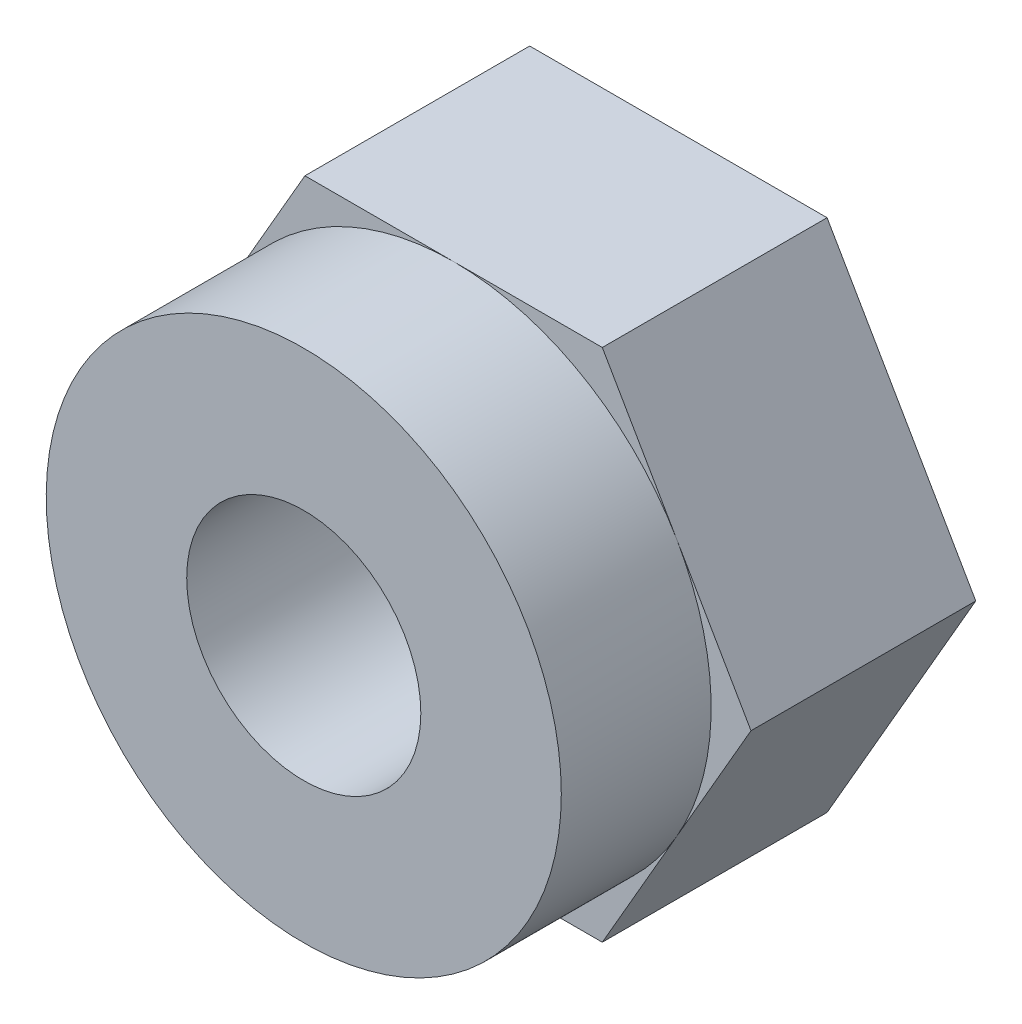
ISO-10303-21;
HEADER;
FILE_DESCRIPTION(('STEP AP214'),'2;1');
FILE_NAME('part.step','',(''),(''),'','','');
FILE_SCHEMA(('AUTOMOTIVE_DESIGN { 1 0 10303 214 1 1 1 1 }'));
ENDSEC;
DATA;
#1=APPLICATION_CONTEXT('core data for automotive mechanical design processes');
#2=APPLICATION_PROTOCOL_DEFINITION('international standard','automotive_design',2000,#1);
#3=PRODUCT_CONTEXT('',#1,'mechanical');
#4=PRODUCT('Part','Part','',(#3));
#5=PRODUCT_RELATED_PRODUCT_CATEGORY('part','',(#4));
#6=PRODUCT_DEFINITION_FORMATION('','',#4);
#7=PRODUCT_DEFINITION_CONTEXT('part definition',#1,'design');
#8=PRODUCT_DEFINITION('design','',#6,#7);
#9=PRODUCT_DEFINITION_SHAPE('','',#8);
#10=(LENGTH_UNIT() NAMED_UNIT(*) SI_UNIT(.MILLI.,.METRE.));
#11=(NAMED_UNIT(*) PLANE_ANGLE_UNIT() SI_UNIT($,.RADIAN.));
#12=(NAMED_UNIT(*) SI_UNIT($,.STERADIAN.) SOLID_ANGLE_UNIT());
#13=UNCERTAINTY_MEASURE_WITH_UNIT(LENGTH_MEASURE(1.E-05),#10,'distance_accuracy_value','');
#14=(GEOMETRIC_REPRESENTATION_CONTEXT(3) GLOBAL_UNCERTAINTY_ASSIGNED_CONTEXT((#13)) GLOBAL_UNIT_ASSIGNED_CONTEXT((#10,
#11,#12)) REPRESENTATION_CONTEXT('',''));
#15=CARTESIAN_POINT('',(0.,0.,0.));
#16=DIRECTION('',(0.,0.,1.));
#17=DIRECTION('',(1.,0.,0.));
#18=AXIS2_PLACEMENT_3D('',#15,#16,#17);
#19=CARTESIAN_POINT('',(0.,0.,2.4));
#20=DIRECTION('',(0.,0.,1.));
#21=DIRECTION('',(1.,0.,0.));
#22=AXIS2_PLACEMENT_3D('',#19,#20,#21);
#23=PLANE('',#22);
#24=DIRECTION('',(0.499999999999999,0.866025403784439,0.));
#25=VECTOR('',#24,1.);
#26=CARTESIAN_POINT('',(1.58771324027147,-2.75,2.4));
#27=LINE('',#26,#25);
#28=CARTESIAN_POINT('',(1.58771324027147,-2.75,2.4));
#29=VERTEX_POINT('',#28);
#30=CARTESIAN_POINT('',(2.3815698604072,-1.375,2.4));
#31=VERTEX_POINT('',#30);
#32=EDGE_CURVE('E200',#29,#31,#27,.T.);
#33=ORIENTED_EDGE('',*,*,#32,.T.);
#34=CARTESIAN_POINT('',(0.,0.,2.4));
#35=DIRECTION('',(0.,0.,1.));
#36=DIRECTION('',(1.,0.,0.));
#37=AXIS2_PLACEMENT_3D('',#34,#35,#36);
#38=CIRCLE('',#37,2.75);
#39=CARTESIAN_POINT('',(0.,-2.75,2.4));
#40=VERTEX_POINT('',#39);
#41=EDGE_CURVE('E49',#31,#40,#38,.F.);
#42=ORIENTED_EDGE('',*,*,#41,.T.);
#43=DIRECTION('',(1.,0.,0.));
#44=VECTOR('',#43,1.);
#45=CARTESIAN_POINT('',(-1.58771324027147,-2.75,2.4));
#46=LINE('',#45,#44);
#47=EDGE_CURVE('E57',#40,#29,#46,.T.);
#48=ORIENTED_EDGE('',*,*,#47,.T.);
#49=EDGE_LOOP('',(#33,#42,#48));
#50=FACE_BOUND('',#49,.T.);
#51=ADVANCED_FACE('F34',(#50),#23,.T.);
#52=CARTESIAN_POINT('',(-1.58771324027147,-2.75,2.4));
#53=VERTEX_POINT('',#52);
#54=EDGE_CURVE('E138',#53,#40,#46,.T.);
#55=ORIENTED_EDGE('',*,*,#54,.T.);
#56=CARTESIAN_POINT('',(-2.3815698604072,-1.375,2.4));
#57=VERTEX_POINT('',#56);
#58=EDGE_CURVE('E179',#40,#57,#38,.F.);
#59=ORIENTED_EDGE('',*,*,#58,.T.);
#60=DIRECTION('',(0.5,-0.866025403784438,0.));
#61=VECTOR('',#60,1.);
#62=CARTESIAN_POINT('',(-3.17542648054294,0.,2.4));
#63=LINE('',#62,#61);
#64=EDGE_CURVE('E136',#57,#53,#63,.T.);
#65=ORIENTED_EDGE('',*,*,#64,.T.);
#66=EDGE_LOOP('',(#55,#59,#65));
#67=FACE_BOUND('',#66,.T.);
#68=ADVANCED_FACE('F178',(#67),#23,.T.);
#69=CARTESIAN_POINT('',(-3.17542648054294,0.,2.4));
#70=VERTEX_POINT('',#69);
#71=EDGE_CURVE('E112',#70,#57,#63,.T.);
#72=ORIENTED_EDGE('',*,*,#71,.T.);
#73=CARTESIAN_POINT('',(-2.38156986040721,1.375,2.4));
#74=VERTEX_POINT('',#73);
#75=EDGE_CURVE('E115',#57,#74,#38,.F.);
#76=ORIENTED_EDGE('',*,*,#75,.T.);
#77=DIRECTION('',(-0.499999999999999,-0.866025403784439,0.));
#78=VECTOR('',#77,1.);
#79=CARTESIAN_POINT('',(-1.58771324027147,2.75,2.4));
#80=LINE('',#79,#78);
#81=EDGE_CURVE('E107',#74,#70,#80,.T.);
#82=ORIENTED_EDGE('',*,*,#81,.T.);
#83=EDGE_LOOP('',(#72,#76,#82));
#84=FACE_BOUND('',#83,.T.);
#85=ADVANCED_FACE('F109',(#84),#23,.T.);
#86=CARTESIAN_POINT('',(-1.58771324027147,2.75,2.4));
#87=VERTEX_POINT('',#86);
#88=EDGE_CURVE('E119',#87,#74,#80,.T.);
#89=ORIENTED_EDGE('',*,*,#88,.T.);
#90=CARTESIAN_POINT('',(0.,2.75,2.4));
#91=VERTEX_POINT('',#90);
#92=EDGE_CURVE('E192',#74,#91,#38,.F.);
#93=ORIENTED_EDGE('',*,*,#92,.T.);
#94=DIRECTION('',(-1.,0.,0.));
#95=VECTOR('',#94,1.);
#96=CARTESIAN_POINT('',(1.58771324027147,2.75,2.4));
#97=LINE('',#96,#95);
#98=EDGE_CURVE('E203',#91,#87,#97,.T.);
#99=ORIENTED_EDGE('',*,*,#98,.T.);
#100=EDGE_LOOP('',(#89,#93,#99));
#101=FACE_BOUND('',#100,.T.);
#102=ADVANCED_FACE('F237',(#101),#23,.T.);
#103=CARTESIAN_POINT('',(1.58771324027147,2.75,2.4));
#104=VERTEX_POINT('',#103);
#105=EDGE_CURVE('E120',#104,#91,#97,.T.);
#106=ORIENTED_EDGE('',*,*,#105,.T.);
#107=CARTESIAN_POINT('',(2.38156986040721,1.375,2.4));
#108=VERTEX_POINT('',#107);
#109=EDGE_CURVE('E187',#91,#108,#38,.F.);
#110=ORIENTED_EDGE('',*,*,#109,.T.);
#111=DIRECTION('',(-0.5,0.866025403784438,0.));
#112=VECTOR('',#111,1.);
#113=CARTESIAN_POINT('',(3.17542648054294,0.,2.4));
#114=LINE('',#113,#112);
#115=EDGE_CURVE('E196',#108,#104,#114,.T.);
#116=ORIENTED_EDGE('',*,*,#115,.T.);
#117=EDGE_LOOP('',(#106,#110,#116));
#118=FACE_BOUND('',#117,.T.);
#119=ADVANCED_FACE('F195',(#118),#23,.T.);
#120=CARTESIAN_POINT('',(3.17542648054294,0.,2.4));
#121=VERTEX_POINT('',#120);
#122=EDGE_CURVE('E198',#121,#108,#114,.T.);
#123=ORIENTED_EDGE('',*,*,#122,.T.);
#124=EDGE_CURVE('E189',#108,#31,#38,.F.);
#125=ORIENTED_EDGE('',*,*,#124,.T.);
#126=EDGE_CURVE('E93',#31,#121,#27,.T.);
#127=ORIENTED_EDGE('',*,*,#126,.T.);
#128=EDGE_LOOP('',(#123,#125,#127));
#129=FACE_BOUND('',#128,.T.);
#130=ADVANCED_FACE('F202',(#129),#23,.T.);
#131=CARTESIAN_POINT('',(0.,0.,0.));
#132=DIRECTION('',(0.,0.,1.));
#133=DIRECTION('',(1.,0.,0.));
#134=AXIS2_PLACEMENT_3D('',#131,#132,#133);
#135=PLANE('',#134);
#136=DIRECTION('',(-0.5,0.866025403784438,0.));
#137=VECTOR('',#136,1.);
#138=CARTESIAN_POINT('',(3.17542648054294,0.,0.));
#139=LINE('',#138,#137);
#140=CARTESIAN_POINT('',(3.17542648054294,0.,0.));
#141=VERTEX_POINT('',#140);
#142=CARTESIAN_POINT('',(1.58771324027147,2.75,0.));
#143=VERTEX_POINT('',#142);
#144=EDGE_CURVE('E146',#141,#143,#139,.T.);
#145=ORIENTED_EDGE('',*,*,#144,.F.);
#146=DIRECTION('',(0.499999999999999,0.866025403784439,0.));
#147=VECTOR('',#146,1.);
#148=CARTESIAN_POINT('',(1.58771324027147,-2.75,0.));
#149=LINE('',#148,#147);
#150=CARTESIAN_POINT('',(1.58771324027147,-2.75,0.));
#151=VERTEX_POINT('',#150);
#152=EDGE_CURVE('E144',#151,#141,#149,.T.);
#153=ORIENTED_EDGE('',*,*,#152,.F.);
#154=DIRECTION('',(1.,0.,0.));
#155=VECTOR('',#154,1.);
#156=CARTESIAN_POINT('',(-1.58771324027147,-2.75,0.));
#157=LINE('',#156,#155);
#158=CARTESIAN_POINT('',(-1.58771324027147,-2.75,0.));
#159=VERTEX_POINT('',#158);
#160=EDGE_CURVE('E85',#159,#151,#157,.T.);
#161=ORIENTED_EDGE('',*,*,#160,.F.);
#162=DIRECTION('',(0.5,-0.866025403784438,0.));
#163=VECTOR('',#162,1.);
#164=CARTESIAN_POINT('',(-3.17542648054294,0.,0.));
#165=LINE('',#164,#163);
#166=CARTESIAN_POINT('',(-3.17542648054294,0.,0.));
#167=VERTEX_POINT('',#166);
#168=EDGE_CURVE('E152',#167,#159,#165,.T.);
#169=ORIENTED_EDGE('',*,*,#168,.F.);
#170=DIRECTION('',(-0.499999999999999,-0.866025403784439,0.));
#171=VECTOR('',#170,1.);
#172=CARTESIAN_POINT('',(-1.58771324027147,2.75,0.));
#173=LINE('',#172,#171);
#174=CARTESIAN_POINT('',(-1.58771324027147,2.75,0.));
#175=VERTEX_POINT('',#174);
#176=EDGE_CURVE('E127',#175,#167,#173,.T.);
#177=ORIENTED_EDGE('',*,*,#176,.F.);
#178=DIRECTION('',(-1.,0.,0.));
#179=VECTOR('',#178,1.);
#180=CARTESIAN_POINT('',(1.58771324027147,2.75,0.));
#181=LINE('',#180,#179);
#182=EDGE_CURVE('E149',#143,#175,#181,.T.);
#183=ORIENTED_EDGE('',*,*,#182,.F.);
#184=EDGE_LOOP('',(#145,#153,#161,#169,#177,#183));
#185=FACE_BOUND('',#184,.T.);
#186=CARTESIAN_POINT('',(0.,0.,0.));
#187=DIRECTION('',(0.,0.,1.));
#188=DIRECTION('',(1.,0.,0.));
#189=AXIS2_PLACEMENT_3D('',#186,#187,#188);
#190=CIRCLE('',#189,1.25);
#191=CARTESIAN_POINT('',(1.25,0.,0.));
#192=VERTEX_POINT('',#191);
#193=EDGE_CURVE('E147',#192,#192,#190,.T.);
#194=ORIENTED_EDGE('',*,*,#193,.T.);
#195=EDGE_LOOP('',(#194));
#196=FACE_BOUND('',#195,.T.);
#197=ADVANCED_FACE('F170',(#185,#196),#135,.F.);
#198=CARTESIAN_POINT('',(1.58771324027147,-2.75,2.4));
#199=DIRECTION('',(-0.866025403784439,0.499999999999999,0.));
#200=DIRECTION('',(-0.499999999999999,-0.866025403784439,0.));
#201=AXIS2_PLACEMENT_3D('',#198,#199,#200);
#202=PLANE('',#201);
#203=ORIENTED_EDGE('',*,*,#152,.T.);
#204=DIRECTION('',(0.,0.,-1.));
#205=VECTOR('',#204,1.);
#206=CARTESIAN_POINT('',(3.17542648054294,0.,2.4));
#207=LINE('',#206,#205);
#208=EDGE_CURVE('E11',#121,#141,#207,.T.);
#209=ORIENTED_EDGE('',*,*,#208,.F.);
#210=ORIENTED_EDGE('',*,*,#126,.F.);
#211=ORIENTED_EDGE('',*,*,#32,.F.);
#212=DIRECTION('',(0.,0.,-1.));
#213=VECTOR('',#212,1.);
#214=CARTESIAN_POINT('',(1.58771324027147,-2.75,2.4));
#215=LINE('',#214,#213);
#216=EDGE_CURVE('E143',#29,#151,#215,.T.);
#217=ORIENTED_EDGE('',*,*,#216,.T.);
#218=EDGE_LOOP('',(#203,#209,#210,#211,#217));
#219=FACE_BOUND('',#218,.T.);
#220=ADVANCED_FACE('F36',(#219),#202,.F.);
#221=CARTESIAN_POINT('',(3.17542648054294,0.,2.4));
#222=DIRECTION('',(-0.866025403784438,-0.5,0.));
#223=DIRECTION('',(0.5,-0.866025403784439,0.));
#224=AXIS2_PLACEMENT_3D('',#221,#222,#223);
#225=PLANE('',#224);
#226=ORIENTED_EDGE('',*,*,#144,.T.);
#227=DIRECTION('',(0.,0.,-1.));
#228=VECTOR('',#227,1.);
#229=CARTESIAN_POINT('',(1.58771324027147,2.75,2.4));
#230=LINE('',#229,#228);
#231=EDGE_CURVE('E42',#104,#143,#230,.T.);
#232=ORIENTED_EDGE('',*,*,#231,.F.);
#233=ORIENTED_EDGE('',*,*,#115,.F.);
#234=ORIENTED_EDGE('',*,*,#122,.F.);
#235=ORIENTED_EDGE('',*,*,#208,.T.);
#236=EDGE_LOOP('',(#226,#232,#233,#234,#235));
#237=FACE_BOUND('',#236,.T.);
#238=ADVANCED_FACE('F197',(#237),#225,.F.);
#239=CARTESIAN_POINT('',(1.58771324027147,2.75,2.4));
#240=DIRECTION('',(0.,-1.,0.));
#241=DIRECTION('',(0.,0.,-1.));
#242=AXIS2_PLACEMENT_3D('',#239,#240,#241);
#243=PLANE('',#242);
#244=ORIENTED_EDGE('',*,*,#182,.T.);
#245=DIRECTION('',(0.,0.,-1.));
#246=VECTOR('',#245,1.);
#247=CARTESIAN_POINT('',(-1.58771324027147,2.75,2.4));
#248=LINE('',#247,#246);
#249=EDGE_CURVE('E130',#87,#175,#248,.T.);
#250=ORIENTED_EDGE('',*,*,#249,.F.);
#251=ORIENTED_EDGE('',*,*,#98,.F.);
#252=ORIENTED_EDGE('',*,*,#105,.F.);
#253=ORIENTED_EDGE('',*,*,#231,.T.);
#254=EDGE_LOOP('',(#244,#250,#251,#252,#253));
#255=FACE_BOUND('',#254,.T.);
#256=ADVANCED_FACE('F162',(#255),#243,.F.);
#257=CARTESIAN_POINT('',(-1.58771324027147,2.75,2.4));
#258=DIRECTION('',(0.866025403784439,-0.499999999999999,0.));
#259=DIRECTION('',(0.499999999999999,0.866025403784439,0.));
#260=AXIS2_PLACEMENT_3D('',#257,#258,#259);
#261=PLANE('',#260);
#262=ORIENTED_EDGE('',*,*,#176,.T.);
#263=DIRECTION('',(0.,0.,-1.));
#264=VECTOR('',#263,1.);
#265=CARTESIAN_POINT('',(-3.17542648054294,0.,2.4));
#266=LINE('',#265,#264);
#267=EDGE_CURVE('E123',#70,#167,#266,.T.);
#268=ORIENTED_EDGE('',*,*,#267,.F.);
#269=ORIENTED_EDGE('',*,*,#81,.F.);
#270=ORIENTED_EDGE('',*,*,#88,.F.);
#271=ORIENTED_EDGE('',*,*,#249,.T.);
#272=EDGE_LOOP('',(#262,#268,#269,#270,#271));
#273=FACE_BOUND('',#272,.T.);
#274=ADVANCED_FACE('F124',(#273),#261,.F.);
#275=CARTESIAN_POINT('',(-3.17542648054294,0.,2.4));
#276=DIRECTION('',(0.866025403784439,0.5,0.));
#277=DIRECTION('',(-0.5,0.866025403784439,0.));
#278=AXIS2_PLACEMENT_3D('',#275,#276,#277);
#279=PLANE('',#278);
#280=ORIENTED_EDGE('',*,*,#168,.T.);
#281=DIRECTION('',(0.,0.,-1.));
#282=VECTOR('',#281,1.);
#283=CARTESIAN_POINT('',(-1.58771324027147,-2.75,2.4));
#284=LINE('',#283,#282);
#285=EDGE_CURVE('E131',#53,#159,#284,.T.);
#286=ORIENTED_EDGE('',*,*,#285,.F.);
#287=ORIENTED_EDGE('',*,*,#64,.F.);
#288=ORIENTED_EDGE('',*,*,#71,.F.);
#289=ORIENTED_EDGE('',*,*,#267,.T.);
#290=EDGE_LOOP('',(#280,#286,#287,#288,#289));
#291=FACE_BOUND('',#290,.T.);
#292=ADVANCED_FACE('F134',(#291),#279,.F.);
#293=CARTESIAN_POINT('',(-1.58771324027147,-2.75,2.4));
#294=DIRECTION('',(0.,1.,0.));
#295=DIRECTION('',(-1.,0.,0.));
#296=AXIS2_PLACEMENT_3D('',#293,#294,#295);
#297=PLANE('',#296);
#298=ORIENTED_EDGE('',*,*,#160,.T.);
#299=ORIENTED_EDGE('',*,*,#216,.F.);
#300=ORIENTED_EDGE('',*,*,#47,.F.);
#301=ORIENTED_EDGE('',*,*,#54,.F.);
#302=ORIENTED_EDGE('',*,*,#285,.T.);
#303=EDGE_LOOP('',(#298,#299,#300,#301,#302));
#304=FACE_BOUND('',#303,.T.);
#305=ADVANCED_FACE('F174',(#304),#297,.F.);
#306=CARTESIAN_POINT('',(0.,0.,2.4));
#307=DIRECTION('',(0.,0.,-1.));
#308=DIRECTION('',(-1.,0.,0.));
#309=AXIS2_PLACEMENT_3D('',#306,#307,#308);
#310=CYLINDRICAL_SURFACE('',#309,1.25);
#311=ORIENTED_EDGE('',*,*,#193,.F.);
#312=EDGE_LOOP('',(#311));
#313=FACE_BOUND('',#312,.T.);
#314=CARTESIAN_POINT('',(0.,0.,4.));
#315=DIRECTION('',(0.,0.,1.));
#316=DIRECTION('',(1.,0.,0.));
#317=AXIS2_PLACEMENT_3D('',#314,#315,#316);
#318=CIRCLE('',#317,1.25);
#319=CARTESIAN_POINT('',(1.25,0.,4.));
#320=VERTEX_POINT('',#319);
#321=EDGE_CURVE('E211',#320,#320,#318,.T.);
#322=ORIENTED_EDGE('',*,*,#321,.T.);
#323=EDGE_LOOP('',(#322));
#324=FACE_BOUND('',#323,.T.);
#325=ADVANCED_FACE('F215',(#313,#324),#310,.F.);
#326=CARTESIAN_POINT('',(0.,0.,4.));
#327=DIRECTION('',(0.,0.,-1.));
#328=DIRECTION('',(-1.,0.,0.));
#329=AXIS2_PLACEMENT_3D('',#326,#327,#328);
#330=CYLINDRICAL_SURFACE('',#329,2.75);
#331=ORIENTED_EDGE('',*,*,#75,.F.);
#332=ORIENTED_EDGE('',*,*,#58,.F.);
#333=ORIENTED_EDGE('',*,*,#41,.F.);
#334=ORIENTED_EDGE('',*,*,#124,.F.);
#335=ORIENTED_EDGE('',*,*,#109,.F.);
#336=ORIENTED_EDGE('',*,*,#92,.F.);
#337=EDGE_LOOP('',(#331,#332,#333,#334,#335,#336));
#338=FACE_BOUND('',#337,.T.);
#339=CARTESIAN_POINT('',(0.,0.,4.));
#340=DIRECTION('',(0.,0.,1.));
#341=DIRECTION('',(1.,0.,0.));
#342=AXIS2_PLACEMENT_3D('',#339,#340,#341);
#343=CIRCLE('',#342,2.75);
#344=CARTESIAN_POINT('',(2.75,0.,4.));
#345=VERTEX_POINT('',#344);
#346=EDGE_CURVE('E208',#345,#345,#343,.T.);
#347=ORIENTED_EDGE('',*,*,#346,.F.);
#348=EDGE_LOOP('',(#347));
#349=FACE_BOUND('',#348,.T.);
#350=ADVANCED_FACE('F190',(#338,#349),#330,.T.);
#351=CARTESIAN_POINT('',(0.,0.,4.));
#352=DIRECTION('',(0.,0.,1.));
#353=DIRECTION('',(1.,0.,0.));
#354=AXIS2_PLACEMENT_3D('',#351,#352,#353);
#355=PLANE('',#354);
#356=ORIENTED_EDGE('',*,*,#346,.T.);
#357=EDGE_LOOP('',(#356));
#358=FACE_BOUND('',#357,.T.);
#359=ORIENTED_EDGE('',*,*,#321,.F.);
#360=EDGE_LOOP('',(#359));
#361=FACE_BOUND('',#360,.T.);
#362=ADVANCED_FACE('F217',(#358,#361),#355,.T.);
#363=CLOSED_SHELL('',(#51,#68,#85,#102,#119,#130,#197,#220,#238,#256,#274,#292,#305,#325,#350,#362));
#364=MANIFOLD_SOLID_BREP('B2',#363);
#365=ADVANCED_BREP_SHAPE_REPRESENTATION('',(#18,#364),#14);
#366=SHAPE_DEFINITION_REPRESENTATION(#9,#365);
ENDSEC;
END-ISO-10303-21;
